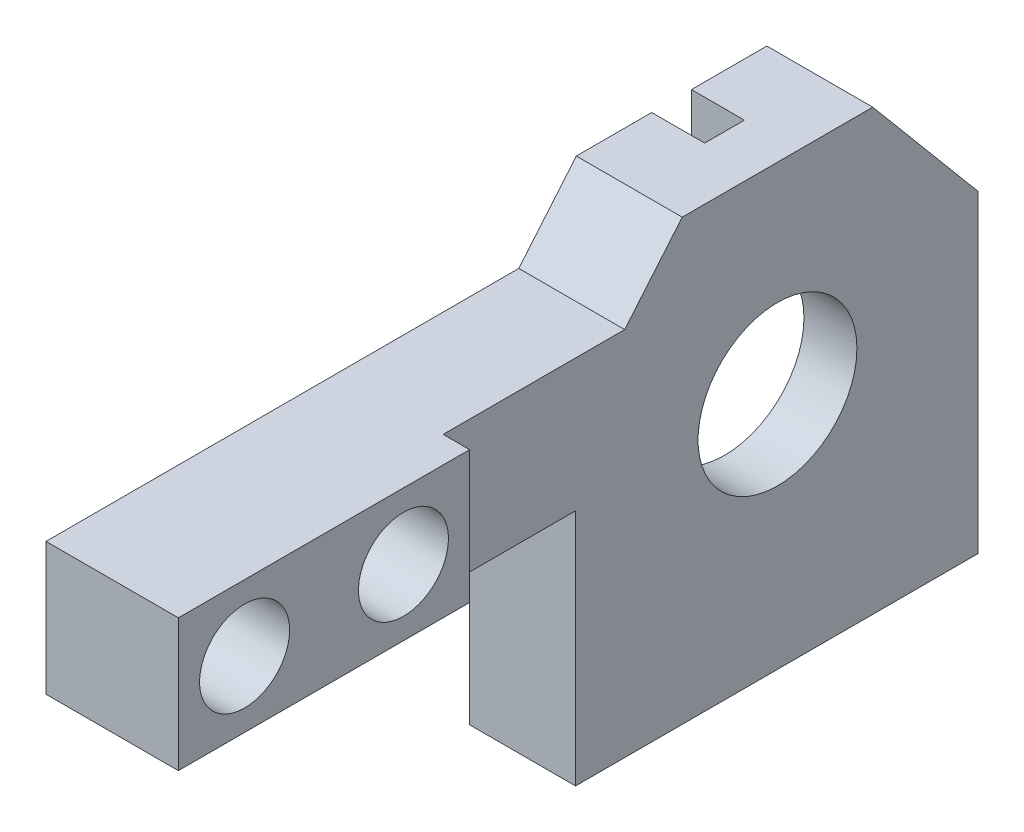
ISO-10303-21;
HEADER;
FILE_DESCRIPTION(('STEP AP214'),'2;1');
FILE_NAME('part.step','',(''),(''),'','','');
FILE_SCHEMA(('AUTOMOTIVE_DESIGN { 1 0 10303 214 1 1 1 1 }'));
ENDSEC;
DATA;
#1=APPLICATION_CONTEXT('core data for automotive mechanical design processes');
#2=APPLICATION_PROTOCOL_DEFINITION('international standard','automotive_design',2000,#1);
#3=PRODUCT_CONTEXT('',#1,'mechanical');
#4=PRODUCT('Part','Part','',(#3));
#5=PRODUCT_RELATED_PRODUCT_CATEGORY('part','',(#4));
#6=PRODUCT_DEFINITION_FORMATION('','',#4);
#7=PRODUCT_DEFINITION_CONTEXT('part definition',#1,'design');
#8=PRODUCT_DEFINITION('design','',#6,#7);
#9=PRODUCT_DEFINITION_SHAPE('','',#8);
#10=(LENGTH_UNIT() NAMED_UNIT(*) SI_UNIT(.MILLI.,.METRE.));
#11=(NAMED_UNIT(*) PLANE_ANGLE_UNIT() SI_UNIT($,.RADIAN.));
#12=(NAMED_UNIT(*) SI_UNIT($,.STERADIAN.) SOLID_ANGLE_UNIT());
#13=UNCERTAINTY_MEASURE_WITH_UNIT(LENGTH_MEASURE(1.E-05),#10,'distance_accuracy_value','');
#14=(GEOMETRIC_REPRESENTATION_CONTEXT(3) GLOBAL_UNCERTAINTY_ASSIGNED_CONTEXT((#13)) GLOBAL_UNIT_ASSIGNED_CONTEXT((#10,
#11,#12)) REPRESENTATION_CONTEXT('',''));
#15=CARTESIAN_POINT('',(0.,0.,0.));
#16=DIRECTION('',(0.,0.,1.));
#17=DIRECTION('',(1.,0.,0.));
#18=AXIS2_PLACEMENT_3D('',#15,#16,#17);
#19=CARTESIAN_POINT('',(0.,0.,0.));
#20=DIRECTION('',(1.,0.,0.));
#21=DIRECTION('',(0.,0.,1.));
#22=AXIS2_PLACEMENT_3D('',#19,#20,#21);
#23=PLANE('',#22);
#24=CARTESIAN_POINT('',(0.,1.90865976235804,0.482116569244563));
#25=DIRECTION('',(1.,0.,0.));
#26=DIRECTION('',(0.,0.,-1.));
#27=AXIS2_PLACEMENT_3D('',#24,#25,#26);
#28=CIRCLE('',#27,3.);
#29=CARTESIAN_POINT('',(0.,1.90865976235804,-2.51788343075544));
#30=VERTEX_POINT('',#29);
#31=EDGE_CURVE('E239',#30,#30,#28,.T.);
#32=ORIENTED_EDGE('',*,*,#31,.T.);
#33=EDGE_LOOP('',(#32));
#34=FACE_BOUND('',#33,.T.);
#35=DIRECTION('',(0.,1.,0.));
#36=VECTOR('',#35,1.);
#37=CARTESIAN_POINT('',(0.,7.49865976235804,1.23211656924456));
#38=LINE('',#37,#36);
#39=CARTESIAN_POINT('',(0.,7.49865976235804,1.23211656924456));
#40=VERTEX_POINT('',#39);
#41=CARTESIAN_POINT('',(0.,9.49865976235804,1.23211656924456));
#42=VERTEX_POINT('',#41);
#43=EDGE_CURVE('E314',#40,#42,#38,.T.);
#44=ORIENTED_EDGE('',*,*,#43,.T.);
#45=DIRECTION('',(0.,0.,1.));
#46=VECTOR('',#45,1.);
#47=CARTESIAN_POINT('',(0.,9.49865976235804,4.07990212889255));
#48=LINE('',#47,#46);
#49=CARTESIAN_POINT('',(0.,9.49865976235804,-0.267883430755437));
#50=VERTEX_POINT('',#49);
#51=EDGE_CURVE('E426',#50,#42,#48,.T.);
#52=ORIENTED_EDGE('',*,*,#51,.F.);
#53=DIRECTION('',(0.,-1.,0.));
#54=VECTOR('',#53,1.);
#55=CARTESIAN_POINT('',(0.,7.49865976235804,-0.267883430755437));
#56=LINE('',#55,#54);
#57=CARTESIAN_POINT('',(0.,7.49865976235804,-0.267883430755437));
#58=VERTEX_POINT('',#57);
#59=EDGE_CURVE('E346',#50,#58,#56,.T.);
#60=ORIENTED_EDGE('',*,*,#59,.T.);
#61=DIRECTION('',(0.,0.,-1.));
#62=VECTOR('',#61,1.);
#63=CARTESIAN_POINT('',(0.,7.49865976235804,-0.267883430755437));
#64=LINE('',#63,#62);
#65=CARTESIAN_POINT('',(0.,7.49865976235804,-2.18305367409341));
#66=VERTEX_POINT('',#65);
#67=EDGE_CURVE('E340',#58,#66,#64,.T.);
#68=ORIENTED_EDGE('',*,*,#67,.T.);
#69=DIRECTION('',(0.,-0.766044443118981,-0.642787609686535));
#70=VECTOR('',#69,1.);
#71=CARTESIAN_POINT('',(0.,4.03347195004924,-5.0906914893617));
#72=LINE('',#71,#70);
#73=CARTESIAN_POINT('',(0.,4.03347195004924,-5.0906914893617));
#74=VERTEX_POINT('',#73);
#75=EDGE_CURVE('E382',#66,#74,#72,.T.);
#76=ORIENTED_EDGE('',*,*,#75,.T.);
#77=DIRECTION('',(0.,-1.,0.));
#78=VECTOR('',#77,1.);
#79=CARTESIAN_POINT('',(0.,4.03347195004924,-5.0906914893617));
#80=LINE('',#79,#78);
#81=CARTESIAN_POINT('',(0.,-5.09134023764196,-5.0906914893617));
#82=VERTEX_POINT('',#81);
#83=EDGE_CURVE('E386',#74,#82,#80,.T.);
#84=ORIENTED_EDGE('',*,*,#83,.T.);
#85=DIRECTION('',(0.,0.,1.));
#86=VECTOR('',#85,1.);
#87=CARTESIAN_POINT('',(0.,-5.09134023764196,-3.01788343075544));
#88=LINE('',#87,#86);
#89=CARTESIAN_POINT('',(0.,-5.09134023764196,-3.01788343075544));
#90=VERTEX_POINT('',#89);
#91=EDGE_CURVE('E390',#82,#90,#88,.T.);
#92=ORIENTED_EDGE('',*,*,#91,.T.);
#93=DIRECTION('',(0.,-1.,0.));
#94=VECTOR('',#93,1.);
#95=CARTESIAN_POINT('',(0.,-5.09134023764196,-3.01788343075544));
#96=LINE('',#95,#94);
#97=CARTESIAN_POINT('',(0.,-7.09134023764196,-3.01788343075544));
#98=VERTEX_POINT('',#97);
#99=EDGE_CURVE('E394',#90,#98,#96,.T.);
#100=ORIENTED_EDGE('',*,*,#99,.T.);
#101=DIRECTION('',(0.,0.,-1.));
#102=VECTOR('',#101,1.);
#103=CARTESIAN_POINT('',(0.,-7.09134023764196,-7.0906914893617));
#104=LINE('',#103,#102);
#105=CARTESIAN_POINT('',(0.,-7.09134023764196,3.98211656924456));
#106=VERTEX_POINT('',#105);
#107=EDGE_CURVE('E421',#106,#98,#104,.T.);
#108=ORIENTED_EDGE('',*,*,#107,.F.);
#109=DIRECTION('',(0.,1.,0.));
#110=VECTOR('',#109,1.);
#111=CARTESIAN_POINT('',(0.,-5.09134023764196,3.98211656924456));
#112=LINE('',#111,#110);
#113=CARTESIAN_POINT('',(0.,-5.09134023764196,3.98211656924456));
#114=VERTEX_POINT('',#113);
#115=EDGE_CURVE('E268',#106,#114,#112,.T.);
#116=ORIENTED_EDGE('',*,*,#115,.T.);
#117=DIRECTION('',(0.,0.,1.));
#118=VECTOR('',#117,1.);
#119=CARTESIAN_POINT('',(0.,-5.09134023764196,6.1093085106383));
#120=LINE('',#119,#118);
#121=CARTESIAN_POINT('',(0.,-5.09134023764196,6.1093085106383));
#122=VERTEX_POINT('',#121);
#123=EDGE_CURVE('E261',#114,#122,#120,.T.);
#124=ORIENTED_EDGE('',*,*,#123,.T.);
#125=DIRECTION('',(0.,1.,0.));
#126=VECTOR('',#125,1.);
#127=CARTESIAN_POINT('',(0.,3.96865976235804,6.1093085106383));
#128=LINE('',#127,#126);
#129=CARTESIAN_POINT('',(0.,3.96865976235804,6.1093085106383));
#130=VERTEX_POINT('',#129);
#131=EDGE_CURVE('E303',#122,#130,#128,.T.);
#132=ORIENTED_EDGE('',*,*,#131,.T.);
#133=DIRECTION('',(0.,0.766044443118982,-0.642787609686534));
#134=VECTOR('',#133,1.);
#135=CARTESIAN_POINT('',(0.,3.96865976235804,6.1093085106383));
#136=LINE('',#135,#134);
#137=CARTESIAN_POINT('',(0.,7.49865976235804,3.14728681258254));
#138=VERTEX_POINT('',#137);
#139=EDGE_CURVE('E307',#130,#138,#136,.T.);
#140=ORIENTED_EDGE('',*,*,#139,.T.);
#141=DIRECTION('',(0.,0.,-1.));
#142=VECTOR('',#141,1.);
#143=CARTESIAN_POINT('',(0.,7.49865976235804,3.14728681258254));
#144=LINE('',#143,#142);
#145=EDGE_CURVE('E311',#138,#40,#144,.T.);
#146=ORIENTED_EDGE('',*,*,#145,.T.);
#147=EDGE_LOOP('',(#44,#52,#60,#68,#76,#84,#92,#100,#108,#116,#124,#132,#140,#146));
#148=FACE_BOUND('',#147,.T.);
#149=ADVANCED_FACE('F39',(#34,#148),#23,.F.);
#150=CARTESIAN_POINT('',(2.,-7.09134023764196,-7.0906914893617));
#151=DIRECTION('',(0.,-1.,0.));
#152=DIRECTION('',(0.,0.,-1.));
#153=AXIS2_PLACEMENT_3D('',#150,#151,#152);
#154=PLANE('',#153);
#155=ORIENTED_EDGE('',*,*,#107,.T.);
#156=DIRECTION('',(1.,0.,0.));
#157=VECTOR('',#156,1.);
#158=CARTESIAN_POINT('',(-2.,-7.09134023764196,-3.01788343075544));
#159=LINE('',#158,#157);
#160=CARTESIAN_POINT('',(-2.,-7.09134023764196,-3.01788343075544));
#161=VERTEX_POINT('',#160);
#162=EDGE_CURVE('E406',#161,#98,#159,.T.);
#163=ORIENTED_EDGE('',*,*,#162,.F.);
#164=DIRECTION('',(0.,0.,-1.));
#165=VECTOR('',#164,1.);
#166=CARTESIAN_POINT('',(-2.,-7.09134023764196,-3.01788343075544));
#167=LINE('',#166,#165);
#168=CARTESIAN_POINT('',(-2.,-7.09134023764196,-7.0906914893617));
#169=VERTEX_POINT('',#168);
#170=EDGE_CURVE('E361',#161,#169,#167,.T.);
#171=ORIENTED_EDGE('',*,*,#170,.T.);
#172=DIRECTION('',(-1.,0.,0.));
#173=VECTOR('',#172,1.);
#174=CARTESIAN_POINT('',(2.,-7.09134023764196,-7.0906914893617));
#175=LINE('',#174,#173);
#176=CARTESIAN_POINT('',(2.,-7.09134023764196,-7.0906914893617));
#177=VERTEX_POINT('',#176);
#178=EDGE_CURVE('E43',#177,#169,#175,.T.);
#179=ORIENTED_EDGE('',*,*,#178,.F.);
#180=DIRECTION('',(0.,0.,-1.));
#181=VECTOR('',#180,1.);
#182=CARTESIAN_POINT('',(2.,-7.09134023764196,-7.0906914893617));
#183=LINE('',#182,#181);
#184=CARTESIAN_POINT('',(2.,-7.09134023764196,8.1093085106383));
#185=VERTEX_POINT('',#184);
#186=EDGE_CURVE('E422',#185,#177,#183,.T.);
#187=ORIENTED_EDGE('',*,*,#186,.F.);
#188=DIRECTION('',(-1.,0.,0.));
#189=VECTOR('',#188,1.);
#190=CARTESIAN_POINT('',(2.,-7.09134023764196,8.1093085106383));
#191=LINE('',#190,#189);
#192=CARTESIAN_POINT('',(-2.,-7.09134023764196,8.1093085106383));
#193=VERTEX_POINT('',#192);
#194=EDGE_CURVE('E11',#185,#193,#191,.T.);
#195=ORIENTED_EDGE('',*,*,#194,.T.);
#196=DIRECTION('',(0.,0.,-1.));
#197=VECTOR('',#196,1.);
#198=CARTESIAN_POINT('',(-2.,-7.09134023764196,8.1093085106383));
#199=LINE('',#198,#197);
#200=CARTESIAN_POINT('',(-2.,-7.09134023764196,3.98211656924456));
#201=VERTEX_POINT('',#200);
#202=EDGE_CURVE('E292',#193,#201,#199,.T.);
#203=ORIENTED_EDGE('',*,*,#202,.T.);
#204=DIRECTION('',(1.,0.,0.));
#205=VECTOR('',#204,1.);
#206=CARTESIAN_POINT('',(-2.,-7.09134023764196,3.98211656924456));
#207=LINE('',#206,#205);
#208=EDGE_CURVE('E323',#201,#106,#207,.T.);
#209=ORIENTED_EDGE('',*,*,#208,.T.);
#210=EDGE_LOOP('',(#155,#163,#171,#179,#187,#195,#203,#209));
#211=FACE_BOUND('',#210,.T.);
#212=ADVANCED_FACE('F41',(#211),#154,.T.);
#213=CARTESIAN_POINT('',(2.,-7.09134023764196,8.1093085106383));
#214=DIRECTION('',(0.,0.,1.));
#215=DIRECTION('',(0.,-1.,0.));
#216=AXIS2_PLACEMENT_3D('',#213,#214,#215);
#217=PLANE('',#216);
#218=DIRECTION('',(-1.,0.,0.));
#219=VECTOR('',#218,1.);
#220=CARTESIAN_POINT('',(3.,1.90865976235804,8.1093085106383));
#221=LINE('',#220,#219);
#222=CARTESIAN_POINT('',(2.,1.90865976235804,8.1093085106383));
#223=VERTEX_POINT('',#222);
#224=CARTESIAN_POINT('',(-2.,1.90865976235804,8.1093085106383));
#225=VERTEX_POINT('',#224);
#226=EDGE_CURVE('E229',#223,#225,#221,.T.);
#227=ORIENTED_EDGE('',*,*,#226,.T.);
#228=DIRECTION('',(0.,-1.,0.));
#229=VECTOR('',#228,1.);
#230=CARTESIAN_POINT('',(-2.,4.69660023089044,8.1093085106383));
#231=LINE('',#230,#229);
#232=EDGE_CURVE('E289',#225,#193,#231,.T.);
#233=ORIENTED_EDGE('',*,*,#232,.T.);
#234=ORIENTED_EDGE('',*,*,#194,.F.);
#235=DIRECTION('',(0.,-1.,0.));
#236=VECTOR('',#235,1.);
#237=CARTESIAN_POINT('',(2.,-7.09134023764196,8.1093085106383));
#238=LINE('',#237,#236);
#239=EDGE_CURVE('E216',#223,#185,#238,.T.);
#240=ORIENTED_EDGE('',*,*,#239,.F.);
#241=EDGE_LOOP('',(#227,#233,#234,#240));
#242=FACE_BOUND('',#241,.T.);
#243=ADVANCED_FACE('F228',(#242),#217,.T.);
#244=CARTESIAN_POINT('',(2.,4.69660023089044,8.1093085106383));
#245=DIRECTION('',(0.,0.642787609686534,0.766044443118982));
#246=DIRECTION('',(0.,-0.766044443118982,0.642787609686534));
#247=AXIS2_PLACEMENT_3D('',#244,#245,#246);
#248=PLANE('',#247);
#249=DIRECTION('',(-1.,0.,0.));
#250=VECTOR('',#249,1.);
#251=CARTESIAN_POINT('',(3.,6.90865976235804,6.25317017364167));
#252=LINE('',#251,#250);
#253=CARTESIAN_POINT('',(2.,6.90865976235804,6.25317017364167));
#254=VERTEX_POINT('',#253);
#255=CARTESIAN_POINT('',(-2.,6.90865976235804,6.25317017364167));
#256=VERTEX_POINT('',#255);
#257=EDGE_CURVE('E254',#254,#256,#252,.T.);
#258=ORIENTED_EDGE('',*,*,#257,.F.);
#259=DIRECTION('',(0.,-0.766044443118982,0.642787609686534));
#260=VECTOR('',#259,1.);
#261=CARTESIAN_POINT('',(2.,4.69660023089044,8.1093085106383));
#262=LINE('',#261,#260);
#263=CARTESIAN_POINT('',(2.,9.49865976235804,4.07990212889255));
#264=VERTEX_POINT('',#263);
#265=EDGE_CURVE('E232',#264,#254,#262,.T.);
#266=ORIENTED_EDGE('',*,*,#265,.F.);
#267=DIRECTION('',(-1.,0.,0.));
#268=VECTOR('',#267,1.);
#269=CARTESIAN_POINT('',(2.,9.49865976235804,4.07990212889255));
#270=LINE('',#269,#268);
#271=CARTESIAN_POINT('',(-2.,9.49865976235804,4.07990212889255));
#272=VERTEX_POINT('',#271);
#273=EDGE_CURVE('E49',#264,#272,#270,.T.);
#274=ORIENTED_EDGE('',*,*,#273,.T.);
#275=DIRECTION('',(0.,-0.766044443118982,0.642787609686534));
#276=VECTOR('',#275,1.);
#277=CARTESIAN_POINT('',(-2.,4.69660023089044,8.1093085106383));
#278=LINE('',#277,#276);
#279=EDGE_CURVE('E285',#272,#256,#278,.T.);
#280=ORIENTED_EDGE('',*,*,#279,.T.);
#281=EDGE_LOOP('',(#258,#266,#274,#280));
#282=FACE_BOUND('',#281,.T.);
#283=ADVANCED_FACE('F525',(#282),#248,.T.);
#284=CARTESIAN_POINT('',(2.,9.49865976235804,4.07990212889255));
#285=DIRECTION('',(0.,1.,0.));
#286=DIRECTION('',(0.,0.,1.));
#287=AXIS2_PLACEMENT_3D('',#284,#285,#286);
#288=PLANE('',#287);
#289=ORIENTED_EDGE('',*,*,#51,.T.);
#290=DIRECTION('',(1.,0.,0.));
#291=VECTOR('',#290,1.);
#292=CARTESIAN_POINT('',(-2.,9.49865976235804,1.23211656924456));
#293=LINE('',#292,#291);
#294=CARTESIAN_POINT('',(-2.,9.49865976235804,1.23211656924456));
#295=VERTEX_POINT('',#294);
#296=EDGE_CURVE('E326',#295,#42,#293,.T.);
#297=ORIENTED_EDGE('',*,*,#296,.F.);
#298=DIRECTION('',(0.,0.,1.));
#299=VECTOR('',#298,1.);
#300=CARTESIAN_POINT('',(-2.,9.49865976235804,4.07990212889255));
#301=LINE('',#300,#299);
#302=EDGE_CURVE('E282',#295,#272,#301,.T.);
#303=ORIENTED_EDGE('',*,*,#302,.T.);
#304=ORIENTED_EDGE('',*,*,#273,.F.);
#305=DIRECTION('',(0.,0.,1.));
#306=VECTOR('',#305,1.);
#307=CARTESIAN_POINT('',(2.,9.49865976235804,4.07990212889255));
#308=LINE('',#307,#306);
#309=CARTESIAN_POINT('',(2.,9.49865976235804,-3.11566899040342));
#310=VERTEX_POINT('',#309);
#311=EDGE_CURVE('E432',#310,#264,#308,.T.);
#312=ORIENTED_EDGE('',*,*,#311,.F.);
#313=DIRECTION('',(-1.,0.,0.));
#314=VECTOR('',#313,1.);
#315=CARTESIAN_POINT('',(2.,9.49865976235804,-3.11566899040342));
#316=LINE('',#315,#314);
#317=CARTESIAN_POINT('',(-2.,9.49865976235804,-3.11566899040342));
#318=VERTEX_POINT('',#317);
#319=EDGE_CURVE('E447',#310,#318,#316,.T.);
#320=ORIENTED_EDGE('',*,*,#319,.T.);
#321=DIRECTION('',(0.,0.,1.));
#322=VECTOR('',#321,1.);
#323=CARTESIAN_POINT('',(-2.,9.49865976235804,-0.267883430755437));
#324=LINE('',#323,#322);
#325=CARTESIAN_POINT('',(-2.,9.49865976235804,-0.267883430755437));
#326=VERTEX_POINT('',#325);
#327=EDGE_CURVE('E371',#318,#326,#324,.T.);
#328=ORIENTED_EDGE('',*,*,#327,.T.);
#329=DIRECTION('',(1.,0.,0.));
#330=VECTOR('',#329,1.);
#331=CARTESIAN_POINT('',(-2.,9.49865976235804,-0.267883430755437));
#332=LINE('',#331,#330);
#333=EDGE_CURVE('E403',#326,#50,#332,.T.);
#334=ORIENTED_EDGE('',*,*,#333,.T.);
#335=EDGE_LOOP('',(#289,#297,#303,#304,#312,#320,#328,#334));
#336=FACE_BOUND('',#335,.T.);
#337=ADVANCED_FACE('F475',(#336),#288,.T.);
#338=CARTESIAN_POINT('',(2.,9.49865976235804,-3.11566899040342));
#339=DIRECTION('',(0.,0.642787609686535,-0.766044443118981));
#340=DIRECTION('',(0.,0.766044443118982,0.642787609686535));
#341=AXIS2_PLACEMENT_3D('',#338,#339,#340);
#342=PLANE('',#341);
#343=ORIENTED_EDGE('',*,*,#319,.F.);
#344=DIRECTION('',(0.,0.766044443118982,0.642787609686535));
#345=VECTOR('',#344,1.);
#346=CARTESIAN_POINT('',(2.,9.49865976235804,-3.11566899040342));
#347=LINE('',#346,#345);
#348=CARTESIAN_POINT('',(2.,4.76141241858164,-7.0906914893617));
#349=VERTEX_POINT('',#348);
#350=EDGE_CURVE('E429',#349,#310,#347,.T.);
#351=ORIENTED_EDGE('',*,*,#350,.F.);
#352=DIRECTION('',(-1.,0.,0.));
#353=VECTOR('',#352,1.);
#354=CARTESIAN_POINT('',(2.,4.76141241858164,-7.0906914893617));
#355=LINE('',#354,#353);
#356=CARTESIAN_POINT('',(-2.,4.76141241858164,-7.0906914893617));
#357=VERTEX_POINT('',#356);
#358=EDGE_CURVE('E450',#349,#357,#355,.T.);
#359=ORIENTED_EDGE('',*,*,#358,.T.);
#360=DIRECTION('',(0.,0.766044443118982,0.642787609686535));
#361=VECTOR('',#360,1.);
#362=CARTESIAN_POINT('',(-2.,9.49865976235804,-3.11566899040342));
#363=LINE('',#362,#361);
#364=EDGE_CURVE('E368',#357,#318,#363,.T.);
#365=ORIENTED_EDGE('',*,*,#364,.T.);
#366=EDGE_LOOP('',(#343,#351,#359,#365));
#367=FACE_BOUND('',#366,.T.);
#368=ADVANCED_FACE('F471',(#367),#342,.T.);
#369=CARTESIAN_POINT('',(2.,4.76141241858164,-7.0906914893617));
#370=DIRECTION('',(0.,0.,-1.));
#371=DIRECTION('',(0.,1.,0.));
#372=AXIS2_PLACEMENT_3D('',#369,#370,#371);
#373=PLANE('',#372);
#374=ORIENTED_EDGE('',*,*,#358,.F.);
#375=DIRECTION('',(0.,1.,0.));
#376=VECTOR('',#375,1.);
#377=CARTESIAN_POINT('',(2.,4.76141241858164,-7.0906914893617));
#378=LINE('',#377,#376);
#379=EDGE_CURVE('E425',#177,#349,#378,.T.);
#380=ORIENTED_EDGE('',*,*,#379,.F.);
#381=ORIENTED_EDGE('',*,*,#178,.T.);
#382=DIRECTION('',(0.,1.,0.));
#383=VECTOR('',#382,1.);
#384=CARTESIAN_POINT('',(-2.,4.76141241858164,-7.0906914893617));
#385=LINE('',#384,#383);
#386=EDGE_CURVE('E365',#169,#357,#385,.T.);
#387=ORIENTED_EDGE('',*,*,#386,.T.);
#388=EDGE_LOOP('',(#374,#380,#381,#387));
#389=FACE_BOUND('',#388,.T.);
#390=ADVANCED_FACE('F460',(#389),#373,.T.);
#391=CARTESIAN_POINT('',(2.,0.,0.));
#392=DIRECTION('',(1.,0.,0.));
#393=DIRECTION('',(0.,0.,1.));
#394=AXIS2_PLACEMENT_3D('',#391,#392,#393);
#395=PLANE('',#394);
#396=ORIENTED_EDGE('',*,*,#239,.T.);
#397=ORIENTED_EDGE('',*,*,#186,.T.);
#398=ORIENTED_EDGE('',*,*,#379,.T.);
#399=ORIENTED_EDGE('',*,*,#350,.T.);
#400=ORIENTED_EDGE('',*,*,#311,.T.);
#401=ORIENTED_EDGE('',*,*,#265,.T.);
#402=DIRECTION('',(0.,0.,-1.));
#403=VECTOR('',#402,1.);
#404=CARTESIAN_POINT('',(2.,6.90865976235804,8.1093085106383));
#405=LINE('',#404,#403);
#406=CARTESIAN_POINT('',(2.,6.90865976235804,13.1093085106383));
#407=VERTEX_POINT('',#406);
#408=EDGE_CURVE('E529',#407,#254,#405,.T.);
#409=ORIENTED_EDGE('',*,*,#408,.F.);
#410=DIRECTION('',(0.,1.,0.));
#411=VECTOR('',#410,1.);
#412=CARTESIAN_POINT('',(2.,6.90865976235804,13.1093085106383));
#413=LINE('',#412,#411);
#414=CARTESIAN_POINT('',(2.,1.90865976235804,13.1093085106383));
#415=VERTEX_POINT('',#414);
#416=EDGE_CURVE('E220',#415,#407,#413,.T.);
#417=ORIENTED_EDGE('',*,*,#416,.F.);
#418=DIRECTION('',(0.,0.,1.));
#419=VECTOR('',#418,1.);
#420=CARTESIAN_POINT('',(2.,1.90865976235804,13.1093085106383));
#421=LINE('',#420,#419);
#422=EDGE_CURVE('E211',#223,#415,#421,.T.);
#423=ORIENTED_EDGE('',*,*,#422,.F.);
#424=EDGE_LOOP('',(#396,#397,#398,#399,#400,#401,#409,#417,#423));
#425=FACE_BOUND('',#424,.T.);
#426=CARTESIAN_POINT('',(2.,1.90865976235804,0.482116569244563));
#427=DIRECTION('',(1.,0.,0.));
#428=DIRECTION('',(0.,0.,-1.));
#429=AXIS2_PLACEMENT_3D('',#426,#427,#428);
#430=CIRCLE('',#429,3.);
#431=CARTESIAN_POINT('',(2.,1.90865976235804,-2.51788343075544));
#432=VERTEX_POINT('',#431);
#433=EDGE_CURVE('E245',#432,#432,#430,.T.);
#434=ORIENTED_EDGE('',*,*,#433,.F.);
#435=EDGE_LOOP('',(#434));
#436=FACE_BOUND('',#435,.T.);
#437=ADVANCED_FACE('F213',(#425,#436),#395,.T.);
#438=CARTESIAN_POINT('',(-2.,7.49865976235804,-0.267883430755437));
#439=DIRECTION('',(0.,1.,0.));
#440=DIRECTION('',(0.,0.,1.));
#441=AXIS2_PLACEMENT_3D('',#438,#439,#440);
#442=PLANE('',#441);
#443=ORIENTED_EDGE('',*,*,#67,.F.);
#444=DIRECTION('',(1.,0.,0.));
#445=VECTOR('',#444,1.);
#446=CARTESIAN_POINT('',(-2.,7.49865976235804,-0.267883430755437));
#447=LINE('',#446,#445);
#448=CARTESIAN_POINT('',(-2.,7.49865976235804,-0.267883430755437));
#449=VERTEX_POINT('',#448);
#450=EDGE_CURVE('E378',#449,#58,#447,.T.);
#451=ORIENTED_EDGE('',*,*,#450,.F.);
#452=DIRECTION('',(0.,0.,-1.));
#453=VECTOR('',#452,1.);
#454=CARTESIAN_POINT('',(-2.,7.49865976235804,-0.267883430755437));
#455=LINE('',#454,#453);
#456=CARTESIAN_POINT('',(-2.,7.49865976235804,-2.18305367409341));
#457=VERTEX_POINT('',#456);
#458=EDGE_CURVE('E341',#449,#457,#455,.T.);
#459=ORIENTED_EDGE('',*,*,#458,.T.);
#460=DIRECTION('',(1.,0.,0.));
#461=VECTOR('',#460,1.);
#462=CARTESIAN_POINT('',(-2.,7.49865976235804,-2.18305367409341));
#463=LINE('',#462,#461);
#464=EDGE_CURVE('E418',#457,#66,#463,.T.);
#465=ORIENTED_EDGE('',*,*,#464,.T.);
#466=EDGE_LOOP('',(#443,#451,#459,#465));
#467=FACE_BOUND('',#466,.T.);
#468=ADVANCED_FACE('F509',(#467),#442,.F.);
#469=CARTESIAN_POINT('',(-2.,4.03347195004924,-5.0906914893617));
#470=DIRECTION('',(0.,0.642787609686535,-0.766044443118982));
#471=DIRECTION('',(0.,0.766044443118982,0.642787609686535));
#472=AXIS2_PLACEMENT_3D('',#469,#470,#471);
#473=PLANE('',#472);
#474=ORIENTED_EDGE('',*,*,#75,.F.);
#475=ORIENTED_EDGE('',*,*,#464,.F.);
#476=DIRECTION('',(0.,-0.766044443118981,-0.642787609686535));
#477=VECTOR('',#476,1.);
#478=CARTESIAN_POINT('',(-2.,4.03347195004924,-5.0906914893617));
#479=LINE('',#478,#477);
#480=CARTESIAN_POINT('',(-2.,4.03347195004924,-5.0906914893617));
#481=VERTEX_POINT('',#480);
#482=EDGE_CURVE('E345',#457,#481,#479,.T.);
#483=ORIENTED_EDGE('',*,*,#482,.T.);
#484=DIRECTION('',(1.,0.,0.));
#485=VECTOR('',#484,1.);
#486=CARTESIAN_POINT('',(-2.,4.03347195004924,-5.0906914893617));
#487=LINE('',#486,#485);
#488=EDGE_CURVE('E415',#481,#74,#487,.T.);
#489=ORIENTED_EDGE('',*,*,#488,.T.);
#490=EDGE_LOOP('',(#474,#475,#483,#489));
#491=FACE_BOUND('',#490,.T.);
#492=ADVANCED_FACE('F505',(#491),#473,.F.);
#493=CARTESIAN_POINT('',(-2.,4.03347195004924,-5.0906914893617));
#494=DIRECTION('',(0.,0.,-1.));
#495=DIRECTION('',(0.,1.,0.));
#496=AXIS2_PLACEMENT_3D('',#493,#494,#495);
#497=PLANE('',#496);
#498=ORIENTED_EDGE('',*,*,#83,.F.);
#499=ORIENTED_EDGE('',*,*,#488,.F.);
#500=DIRECTION('',(0.,-1.,0.));
#501=VECTOR('',#500,1.);
#502=CARTESIAN_POINT('',(-2.,4.03347195004924,-5.0906914893617));
#503=LINE('',#502,#501);
#504=CARTESIAN_POINT('',(-2.,-5.09134023764196,-5.0906914893617));
#505=VERTEX_POINT('',#504);
#506=EDGE_CURVE('E350',#481,#505,#503,.T.);
#507=ORIENTED_EDGE('',*,*,#506,.T.);
#508=DIRECTION('',(1.,0.,0.));
#509=VECTOR('',#508,1.);
#510=CARTESIAN_POINT('',(-2.,-5.09134023764196,-5.0906914893617));
#511=LINE('',#510,#509);
#512=EDGE_CURVE('E412',#505,#82,#511,.T.);
#513=ORIENTED_EDGE('',*,*,#512,.T.);
#514=EDGE_LOOP('',(#498,#499,#507,#513));
#515=FACE_BOUND('',#514,.T.);
#516=ADVANCED_FACE('F502',(#515),#497,.F.);
#517=CARTESIAN_POINT('',(-2.,-5.09134023764196,-3.01788343075544));
#518=DIRECTION('',(0.,-1.,0.));
#519=DIRECTION('',(0.,0.,-1.));
#520=AXIS2_PLACEMENT_3D('',#517,#518,#519);
#521=PLANE('',#520);
#522=ORIENTED_EDGE('',*,*,#91,.F.);
#523=ORIENTED_EDGE('',*,*,#512,.F.);
#524=DIRECTION('',(0.,0.,1.));
#525=VECTOR('',#524,1.);
#526=CARTESIAN_POINT('',(-2.,-5.09134023764196,-3.01788343075544));
#527=LINE('',#526,#525);
#528=CARTESIAN_POINT('',(-2.,-5.09134023764196,-3.01788343075544));
#529=VERTEX_POINT('',#528);
#530=EDGE_CURVE('E354',#505,#529,#527,.T.);
#531=ORIENTED_EDGE('',*,*,#530,.T.);
#532=DIRECTION('',(1.,0.,0.));
#533=VECTOR('',#532,1.);
#534=CARTESIAN_POINT('',(-2.,-5.09134023764196,-3.01788343075544));
#535=LINE('',#534,#533);
#536=EDGE_CURVE('E409',#529,#90,#535,.T.);
#537=ORIENTED_EDGE('',*,*,#536,.T.);
#538=EDGE_LOOP('',(#522,#523,#531,#537));
#539=FACE_BOUND('',#538,.T.);
#540=ADVANCED_FACE('F497',(#539),#521,.F.);
#541=CARTESIAN_POINT('',(-2.,-5.09134023764196,-3.01788343075544));
#542=DIRECTION('',(0.,0.,-1.));
#543=DIRECTION('',(0.,1.,0.));
#544=AXIS2_PLACEMENT_3D('',#541,#542,#543);
#545=PLANE('',#544);
#546=ORIENTED_EDGE('',*,*,#99,.F.);
#547=ORIENTED_EDGE('',*,*,#536,.F.);
#548=DIRECTION('',(0.,-1.,0.));
#549=VECTOR('',#548,1.);
#550=CARTESIAN_POINT('',(-2.,-5.09134023764196,-3.01788343075544));
#551=LINE('',#550,#549);
#552=EDGE_CURVE('E358',#529,#161,#551,.T.);
#553=ORIENTED_EDGE('',*,*,#552,.T.);
#554=ORIENTED_EDGE('',*,*,#162,.T.);
#555=EDGE_LOOP('',(#546,#547,#553,#554));
#556=FACE_BOUND('',#555,.T.);
#557=ADVANCED_FACE('F494',(#556),#545,.F.);
#558=CARTESIAN_POINT('',(-2.,7.49865976235804,-0.267883430755437));
#559=DIRECTION('',(0.,0.,-1.));
#560=DIRECTION('',(1.,0.,0.));
#561=AXIS2_PLACEMENT_3D('',#558,#559,#560);
#562=PLANE('',#561);
#563=ORIENTED_EDGE('',*,*,#59,.F.);
#564=ORIENTED_EDGE('',*,*,#333,.F.);
#565=DIRECTION('',(0.,-1.,0.));
#566=VECTOR('',#565,1.);
#567=CARTESIAN_POINT('',(-2.,7.49865976235804,-0.267883430755437));
#568=LINE('',#567,#566);
#569=EDGE_CURVE('E375',#326,#449,#568,.T.);
#570=ORIENTED_EDGE('',*,*,#569,.T.);
#571=ORIENTED_EDGE('',*,*,#450,.T.);
#572=EDGE_LOOP('',(#563,#564,#570,#571));
#573=FACE_BOUND('',#572,.T.);
#574=ADVANCED_FACE('F513',(#573),#562,.F.);
#575=CARTESIAN_POINT('',(-2.,0.,0.));
#576=DIRECTION('',(1.,0.,0.));
#577=DIRECTION('',(0.,0.,1.));
#578=AXIS2_PLACEMENT_3D('',#575,#576,#577);
#579=PLANE('',#578);
#580=ORIENTED_EDGE('',*,*,#458,.F.);
#581=ORIENTED_EDGE('',*,*,#569,.F.);
#582=ORIENTED_EDGE('',*,*,#327,.F.);
#583=ORIENTED_EDGE('',*,*,#364,.F.);
#584=ORIENTED_EDGE('',*,*,#386,.F.);
#585=ORIENTED_EDGE('',*,*,#170,.F.);
#586=ORIENTED_EDGE('',*,*,#552,.F.);
#587=ORIENTED_EDGE('',*,*,#530,.F.);
#588=ORIENTED_EDGE('',*,*,#506,.F.);
#589=ORIENTED_EDGE('',*,*,#482,.F.);
#590=EDGE_LOOP('',(#580,#581,#582,#583,#584,#585,#586,#587,#588,#589));
#591=FACE_BOUND('',#590,.T.);
#592=ADVANCED_FACE('F467',(#591),#579,.F.);
#593=CARTESIAN_POINT('',(-2.,-5.09134023764196,6.1093085106383));
#594=DIRECTION('',(0.,-1.,0.));
#595=DIRECTION('',(0.,0.,-1.));
#596=AXIS2_PLACEMENT_3D('',#593,#594,#595);
#597=PLANE('',#596);
#598=ORIENTED_EDGE('',*,*,#123,.F.);
#599=DIRECTION('',(1.,0.,0.));
#600=VECTOR('',#599,1.);
#601=CARTESIAN_POINT('',(-2.,-5.09134023764196,3.98211656924456));
#602=LINE('',#601,#600);
#603=CARTESIAN_POINT('',(-2.,-5.09134023764196,3.98211656924456));
#604=VERTEX_POINT('',#603);
#605=EDGE_CURVE('E299',#604,#114,#602,.T.);
#606=ORIENTED_EDGE('',*,*,#605,.F.);
#607=DIRECTION('',(0.,0.,1.));
#608=VECTOR('',#607,1.);
#609=CARTESIAN_POINT('',(-2.,-5.09134023764196,6.1093085106383));
#610=LINE('',#609,#608);
#611=CARTESIAN_POINT('',(-2.,-5.09134023764196,6.1093085106383));
#612=VERTEX_POINT('',#611);
#613=EDGE_CURVE('E263',#604,#612,#610,.T.);
#614=ORIENTED_EDGE('',*,*,#613,.T.);
#615=DIRECTION('',(1.,0.,0.));
#616=VECTOR('',#615,1.);
#617=CARTESIAN_POINT('',(-2.,-5.09134023764196,6.1093085106383));
#618=LINE('',#617,#616);
#619=EDGE_CURVE('E337',#612,#122,#618,.T.);
#620=ORIENTED_EDGE('',*,*,#619,.T.);
#621=EDGE_LOOP('',(#598,#606,#614,#620));
#622=FACE_BOUND('',#621,.T.);
#623=ADVANCED_FACE('F634',(#622),#597,.F.);
#624=CARTESIAN_POINT('',(-2.,3.96865976235804,6.1093085106383));
#625=DIRECTION('',(0.,0.,1.));
#626=DIRECTION('',(0.,-1.,0.));
#627=AXIS2_PLACEMENT_3D('',#624,#625,#626);
#628=PLANE('',#627);
#629=ORIENTED_EDGE('',*,*,#131,.F.);
#630=ORIENTED_EDGE('',*,*,#619,.F.);
#631=DIRECTION('',(0.,1.,0.));
#632=VECTOR('',#631,1.);
#633=CARTESIAN_POINT('',(-2.,3.96865976235804,6.1093085106383));
#634=LINE('',#633,#632);
#635=CARTESIAN_POINT('',(-2.,3.96865976235804,6.1093085106383));
#636=VERTEX_POINT('',#635);
#637=EDGE_CURVE('E267',#612,#636,#634,.T.);
#638=ORIENTED_EDGE('',*,*,#637,.T.);
#639=DIRECTION('',(1.,0.,0.));
#640=VECTOR('',#639,1.);
#641=CARTESIAN_POINT('',(-2.,3.96865976235804,6.1093085106383));
#642=LINE('',#641,#640);
#643=EDGE_CURVE('E334',#636,#130,#642,.T.);
#644=ORIENTED_EDGE('',*,*,#643,.T.);
#645=EDGE_LOOP('',(#629,#630,#638,#644));
#646=FACE_BOUND('',#645,.T.);
#647=ADVANCED_FACE('F637',(#646),#628,.F.);
#648=CARTESIAN_POINT('',(-2.,3.96865976235804,6.1093085106383));
#649=DIRECTION('',(0.,0.642787609686534,0.766044443118982));
#650=DIRECTION('',(0.,-0.766044443118982,0.642787609686534));
#651=AXIS2_PLACEMENT_3D('',#648,#649,#650);
#652=PLANE('',#651);
#653=ORIENTED_EDGE('',*,*,#139,.F.);
#654=ORIENTED_EDGE('',*,*,#643,.F.);
#655=DIRECTION('',(0.,0.766044443118982,-0.642787609686534));
#656=VECTOR('',#655,1.);
#657=CARTESIAN_POINT('',(-2.,3.96865976235804,6.1093085106383));
#658=LINE('',#657,#656);
#659=CARTESIAN_POINT('',(-2.,7.49865976235804,3.14728681258254));
#660=VERTEX_POINT('',#659);
#661=EDGE_CURVE('E272',#636,#660,#658,.T.);
#662=ORIENTED_EDGE('',*,*,#661,.T.);
#663=DIRECTION('',(1.,0.,0.));
#664=VECTOR('',#663,1.);
#665=CARTESIAN_POINT('',(-2.,7.49865976235804,3.14728681258254));
#666=LINE('',#665,#664);
#667=EDGE_CURVE('E331',#660,#138,#666,.T.);
#668=ORIENTED_EDGE('',*,*,#667,.T.);
#669=EDGE_LOOP('',(#653,#654,#662,#668));
#670=FACE_BOUND('',#669,.T.);
#671=ADVANCED_FACE('F641',(#670),#652,.F.);
#672=CARTESIAN_POINT('',(-2.,7.49865976235804,3.14728681258254));
#673=DIRECTION('',(0.,1.,0.));
#674=DIRECTION('',(0.,0.,1.));
#675=AXIS2_PLACEMENT_3D('',#672,#673,#674);
#676=PLANE('',#675);
#677=ORIENTED_EDGE('',*,*,#145,.F.);
#678=ORIENTED_EDGE('',*,*,#667,.F.);
#679=DIRECTION('',(0.,0.,-1.));
#680=VECTOR('',#679,1.);
#681=CARTESIAN_POINT('',(-2.,7.49865976235804,3.14728681258254));
#682=LINE('',#681,#680);
#683=CARTESIAN_POINT('',(-2.,7.49865976235804,1.23211656924456));
#684=VERTEX_POINT('',#683);
#685=EDGE_CURVE('E276',#660,#684,#682,.T.);
#686=ORIENTED_EDGE('',*,*,#685,.T.);
#687=DIRECTION('',(1.,0.,0.));
#688=VECTOR('',#687,1.);
#689=CARTESIAN_POINT('',(-2.,7.49865976235804,1.23211656924456));
#690=LINE('',#689,#688);
#691=EDGE_CURVE('E65',#684,#40,#690,.T.);
#692=ORIENTED_EDGE('',*,*,#691,.T.);
#693=EDGE_LOOP('',(#677,#678,#686,#692));
#694=FACE_BOUND('',#693,.T.);
#695=ADVANCED_FACE('F645',(#694),#676,.F.);
#696=CARTESIAN_POINT('',(-2.,7.49865976235804,1.23211656924456));
#697=DIRECTION('',(0.,0.,1.));
#698=DIRECTION('',(-1.,0.,0.));
#699=AXIS2_PLACEMENT_3D('',#696,#697,#698);
#700=PLANE('',#699);
#701=ORIENTED_EDGE('',*,*,#43,.F.);
#702=ORIENTED_EDGE('',*,*,#691,.F.);
#703=DIRECTION('',(0.,1.,0.));
#704=VECTOR('',#703,1.);
#705=CARTESIAN_POINT('',(-2.,7.49865976235804,1.23211656924456));
#706=LINE('',#705,#704);
#707=EDGE_CURVE('E279',#684,#295,#706,.T.);
#708=ORIENTED_EDGE('',*,*,#707,.T.);
#709=ORIENTED_EDGE('',*,*,#296,.T.);
#710=EDGE_LOOP('',(#701,#702,#708,#709));
#711=FACE_BOUND('',#710,.T.);
#712=ADVANCED_FACE('F518',(#711),#700,.F.);
#713=CARTESIAN_POINT('',(-2.,-5.09134023764196,3.98211656924456));
#714=DIRECTION('',(0.,0.,1.));
#715=DIRECTION('',(-1.,0.,0.));
#716=AXIS2_PLACEMENT_3D('',#713,#714,#715);
#717=PLANE('',#716);
#718=ORIENTED_EDGE('',*,*,#115,.F.);
#719=ORIENTED_EDGE('',*,*,#208,.F.);
#720=DIRECTION('',(0.,1.,0.));
#721=VECTOR('',#720,1.);
#722=CARTESIAN_POINT('',(-2.,-5.09134023764196,3.98211656924456));
#723=LINE('',#722,#721);
#724=EDGE_CURVE('E296',#201,#604,#723,.T.);
#725=ORIENTED_EDGE('',*,*,#724,.T.);
#726=ORIENTED_EDGE('',*,*,#605,.T.);
#727=EDGE_LOOP('',(#718,#719,#725,#726));
#728=FACE_BOUND('',#727,.T.);
#729=ADVANCED_FACE('F487',(#728),#717,.F.);
#730=CARTESIAN_POINT('',(-2.,0.,0.));
#731=DIRECTION('',(1.,0.,0.));
#732=DIRECTION('',(0.,0.,1.));
#733=AXIS2_PLACEMENT_3D('',#730,#731,#732);
#734=PLANE('',#733);
#735=DIRECTION('',(0.,0.,-1.));
#736=VECTOR('',#735,1.);
#737=CARTESIAN_POINT('',(-2.,1.90865976235804,15.4821165692446));
#738=LINE('',#737,#736);
#739=CARTESIAN_POINT('',(-2.,1.90865976235804,24.1093085106383));
#740=VERTEX_POINT('',#739);
#741=EDGE_CURVE('E236',#740,#225,#738,.T.);
#742=ORIENTED_EDGE('',*,*,#741,.F.);
#743=DIRECTION('',(0.,-1.,0.));
#744=VECTOR('',#743,1.);
#745=CARTESIAN_POINT('',(-2.,1.90865976235804,24.1093085106383));
#746=LINE('',#745,#744);
#747=CARTESIAN_POINT('',(-2.,6.90865976235804,24.1093085106383));
#748=VERTEX_POINT('',#747);
#749=EDGE_CURVE('E569',#748,#740,#746,.T.);
#750=ORIENTED_EDGE('',*,*,#749,.F.);
#751=DIRECTION('',(0.,0.,1.));
#752=VECTOR('',#751,1.);
#753=CARTESIAN_POINT('',(-2.,6.90865976235804,24.1093085106383));
#754=LINE('',#753,#752);
#755=EDGE_CURVE('E523',#256,#748,#754,.T.);
#756=ORIENTED_EDGE('',*,*,#755,.F.);
#757=ORIENTED_EDGE('',*,*,#279,.F.);
#758=ORIENTED_EDGE('',*,*,#302,.F.);
#759=ORIENTED_EDGE('',*,*,#707,.F.);
#760=ORIENTED_EDGE('',*,*,#685,.F.);
#761=ORIENTED_EDGE('',*,*,#661,.F.);
#762=ORIENTED_EDGE('',*,*,#637,.F.);
#763=ORIENTED_EDGE('',*,*,#613,.F.);
#764=ORIENTED_EDGE('',*,*,#724,.F.);
#765=ORIENTED_EDGE('',*,*,#202,.F.);
#766=ORIENTED_EDGE('',*,*,#232,.F.);
#767=EDGE_LOOP('',(#742,#750,#756,#757,#758,#759,#760,#761,#762,#763,#764,#765,#766));
#768=FACE_BOUND('',#767,.T.);
#769=CARTESIAN_POINT('',(-2.,4.40865976235804,21.6093085106383));
#770=DIRECTION('',(1.,0.,0.));
#771=DIRECTION('',(0.,0.,-1.));
#772=AXIS2_PLACEMENT_3D('',#769,#770,#771);
#773=CIRCLE('',#772,1.7);
#774=CARTESIAN_POINT('',(-2.,4.40865976235804,19.9093085106383));
#775=VERTEX_POINT('',#774);
#776=EDGE_CURVE('E543',#775,#775,#773,.T.);
#777=ORIENTED_EDGE('',*,*,#776,.T.);
#778=EDGE_LOOP('',(#777));
#779=FACE_BOUND('',#778,.T.);
#780=CARTESIAN_POINT('',(-2.,4.40865976235804,15.6093085106383));
#781=DIRECTION('',(1.,0.,0.));
#782=DIRECTION('',(0.,0.,-1.));
#783=AXIS2_PLACEMENT_3D('',#780,#781,#782);
#784=CIRCLE('',#783,1.7);
#785=CARTESIAN_POINT('',(-2.,4.40865976235804,13.9093085106383));
#786=VERTEX_POINT('',#785);
#787=EDGE_CURVE('E549',#786,#786,#784,.T.);
#788=ORIENTED_EDGE('',*,*,#787,.T.);
#789=EDGE_LOOP('',(#788));
#790=FACE_BOUND('',#789,.T.);
#791=ADVANCED_FACE('F482',(#768,#779,#790),#734,.F.);
#792=CARTESIAN_POINT('',(2.,1.90865976235804,0.482116569244563));
#793=DIRECTION('',(-1.,0.,0.));
#794=DIRECTION('',(0.,0.,-1.));
#795=AXIS2_PLACEMENT_3D('',#792,#793,#794);
#796=CYLINDRICAL_SURFACE('',#795,3.);
#797=ORIENTED_EDGE('',*,*,#433,.T.);
#798=EDGE_LOOP('',(#797));
#799=FACE_BOUND('',#798,.T.);
#800=ORIENTED_EDGE('',*,*,#31,.F.);
#801=EDGE_LOOP('',(#800));
#802=FACE_BOUND('',#801,.T.);
#803=ADVANCED_FACE('F655',(#799,#802),#796,.F.);
#804=CARTESIAN_POINT('',(3.,1.90865976235804,15.4821165692446));
#805=DIRECTION('',(0.,-1.,0.));
#806=DIRECTION('',(0.,0.,-1.));
#807=AXIS2_PLACEMENT_3D('',#804,#805,#806);
#808=PLANE('',#807);
#809=DIRECTION('',(1.,0.,0.));
#810=VECTOR('',#809,1.);
#811=CARTESIAN_POINT('',(2.,1.90865976235804,13.1093085106383));
#812=LINE('',#811,#810);
#813=CARTESIAN_POINT('',(3.,1.90865976235804,13.1093085106383));
#814=VERTEX_POINT('',#813);
#815=EDGE_CURVE('E533',#415,#814,#812,.T.);
#816=ORIENTED_EDGE('',*,*,#815,.T.);
#817=DIRECTION('',(0.,0.,-1.));
#818=VECTOR('',#817,1.);
#819=CARTESIAN_POINT('',(3.,1.90865976235804,15.4821165692446));
#820=LINE('',#819,#818);
#821=CARTESIAN_POINT('',(3.,1.90865976235804,24.1093085106383));
#822=VERTEX_POINT('',#821);
#823=EDGE_CURVE('E258',#822,#814,#820,.T.);
#824=ORIENTED_EDGE('',*,*,#823,.F.);
#825=DIRECTION('',(-1.,0.,0.));
#826=VECTOR('',#825,1.);
#827=CARTESIAN_POINT('',(3.,1.90865976235804,24.1093085106383));
#828=LINE('',#827,#826);
#829=EDGE_CURVE('E240',#822,#740,#828,.T.);
#830=ORIENTED_EDGE('',*,*,#829,.T.);
#831=ORIENTED_EDGE('',*,*,#741,.T.);
#832=ORIENTED_EDGE('',*,*,#226,.F.);
#833=ORIENTED_EDGE('',*,*,#422,.T.);
#834=EDGE_LOOP('',(#816,#824,#830,#831,#832,#833));
#835=FACE_BOUND('',#834,.T.);
#836=ADVANCED_FACE('F234',(#835),#808,.T.);
#837=CARTESIAN_POINT('',(3.,1.90865976235804,24.1093085106383));
#838=DIRECTION('',(0.,0.,1.));
#839=DIRECTION('',(-1.,0.,0.));
#840=AXIS2_PLACEMENT_3D('',#837,#838,#839);
#841=PLANE('',#840);
#842=ORIENTED_EDGE('',*,*,#749,.T.);
#843=ORIENTED_EDGE('',*,*,#829,.F.);
#844=DIRECTION('',(0.,-1.,0.));
#845=VECTOR('',#844,1.);
#846=CARTESIAN_POINT('',(3.,1.90865976235804,24.1093085106383));
#847=LINE('',#846,#845);
#848=CARTESIAN_POINT('',(3.,6.90865976235804,24.1093085106383));
#849=VERTEX_POINT('',#848);
#850=EDGE_CURVE('E563',#849,#822,#847,.T.);
#851=ORIENTED_EDGE('',*,*,#850,.F.);
#852=DIRECTION('',(-1.,0.,0.));
#853=VECTOR('',#852,1.);
#854=CARTESIAN_POINT('',(3.,6.90865976235804,24.1093085106383));
#855=LINE('',#854,#853);
#856=EDGE_CURVE('E247',#849,#748,#855,.T.);
#857=ORIENTED_EDGE('',*,*,#856,.T.);
#858=EDGE_LOOP('',(#842,#843,#851,#857));
#859=FACE_BOUND('',#858,.T.);
#860=ADVANCED_FACE('F575',(#859),#841,.T.);
#861=CARTESIAN_POINT('',(3.,6.90865976235804,24.1093085106383));
#862=DIRECTION('',(0.,1.,0.));
#863=DIRECTION('',(0.,0.,1.));
#864=AXIS2_PLACEMENT_3D('',#861,#862,#863);
#865=PLANE('',#864);
#866=DIRECTION('',(1.,0.,0.));
#867=VECTOR('',#866,1.);
#868=CARTESIAN_POINT('',(2.,6.90865976235804,13.1093085106383));
#869=LINE('',#868,#867);
#870=CARTESIAN_POINT('',(3.,6.90865976235804,13.1093085106383));
#871=VERTEX_POINT('',#870);
#872=EDGE_CURVE('E531',#407,#871,#869,.T.);
#873=ORIENTED_EDGE('',*,*,#872,.F.);
#874=ORIENTED_EDGE('',*,*,#408,.T.);
#875=ORIENTED_EDGE('',*,*,#257,.T.);
#876=ORIENTED_EDGE('',*,*,#755,.T.);
#877=ORIENTED_EDGE('',*,*,#856,.F.);
#878=DIRECTION('',(0.,0.,1.));
#879=VECTOR('',#878,1.);
#880=CARTESIAN_POINT('',(3.,6.90865976235804,6.25317017364167));
#881=LINE('',#880,#879);
#882=EDGE_CURVE('E560',#871,#849,#881,.T.);
#883=ORIENTED_EDGE('',*,*,#882,.F.);
#884=EDGE_LOOP('',(#873,#874,#875,#876,#877,#883));
#885=FACE_BOUND('',#884,.T.);
#886=ADVANCED_FACE('F527',(#885),#865,.T.);
#887=CARTESIAN_POINT('',(3.,0.,0.));
#888=DIRECTION('',(-1.,0.,0.));
#889=DIRECTION('',(0.,0.,-1.));
#890=AXIS2_PLACEMENT_3D('',#887,#888,#889);
#891=PLANE('',#890);
#892=CARTESIAN_POINT('',(3.,4.40865976235804,21.6093085106383));
#893=DIRECTION('',(1.,0.,0.));
#894=DIRECTION('',(0.,0.,-1.));
#895=AXIS2_PLACEMENT_3D('',#892,#893,#894);
#896=CIRCLE('',#895,1.7);
#897=CARTESIAN_POINT('',(3.,4.40865976235804,19.9093085106383));
#898=VERTEX_POINT('',#897);
#899=EDGE_CURVE('E545',#898,#898,#896,.T.);
#900=ORIENTED_EDGE('',*,*,#899,.F.);
#901=EDGE_LOOP('',(#900));
#902=FACE_BOUND('',#901,.T.);
#903=CARTESIAN_POINT('',(3.,4.40865976235804,15.6093085106383));
#904=DIRECTION('',(1.,0.,0.));
#905=DIRECTION('',(0.,0.,-1.));
#906=AXIS2_PLACEMENT_3D('',#903,#904,#905);
#907=CIRCLE('',#906,1.7);
#908=CARTESIAN_POINT('',(3.,4.40865976235804,13.9093085106383));
#909=VERTEX_POINT('',#908);
#910=EDGE_CURVE('E553',#909,#909,#907,.T.);
#911=ORIENTED_EDGE('',*,*,#910,.F.);
#912=EDGE_LOOP('',(#911));
#913=FACE_BOUND('',#912,.T.);
#914=ORIENTED_EDGE('',*,*,#882,.T.);
#915=ORIENTED_EDGE('',*,*,#850,.T.);
#916=ORIENTED_EDGE('',*,*,#823,.T.);
#917=DIRECTION('',(0.,1.,0.));
#918=VECTOR('',#917,1.);
#919=CARTESIAN_POINT('',(3.,6.90865976235804,13.1093085106383));
#920=LINE('',#919,#918);
#921=EDGE_CURVE('E57',#814,#871,#920,.T.);
#922=ORIENTED_EDGE('',*,*,#921,.T.);
#923=EDGE_LOOP('',(#914,#915,#916,#922));
#924=FACE_BOUND('',#923,.T.);
#925=ADVANCED_FACE('F580',(#902,#913,#924),#891,.F.);
#926=CARTESIAN_POINT('',(3.,4.40865976235804,15.6093085106383));
#927=DIRECTION('',(-1.,0.,0.));
#928=DIRECTION('',(0.,0.,-1.));
#929=AXIS2_PLACEMENT_3D('',#926,#927,#928);
#930=CYLINDRICAL_SURFACE('',#929,1.7);
#931=ORIENTED_EDGE('',*,*,#910,.T.);
#932=EDGE_LOOP('',(#931));
#933=FACE_BOUND('',#932,.T.);
#934=ORIENTED_EDGE('',*,*,#787,.F.);
#935=EDGE_LOOP('',(#934));
#936=FACE_BOUND('',#935,.T.);
#937=ADVANCED_FACE('F582',(#933,#936),#930,.F.);
#938=CARTESIAN_POINT('',(3.,4.40865976235804,21.6093085106383));
#939=DIRECTION('',(-1.,0.,0.));
#940=DIRECTION('',(0.,0.,-1.));
#941=AXIS2_PLACEMENT_3D('',#938,#939,#940);
#942=CYLINDRICAL_SURFACE('',#941,1.7);
#943=ORIENTED_EDGE('',*,*,#899,.T.);
#944=EDGE_LOOP('',(#943));
#945=FACE_BOUND('',#944,.T.);
#946=ORIENTED_EDGE('',*,*,#776,.F.);
#947=EDGE_LOOP('',(#946));
#948=FACE_BOUND('',#947,.T.);
#949=ADVANCED_FACE('F589',(#945,#948),#942,.F.);
#950=CARTESIAN_POINT('',(2.,6.90865976235804,13.1093085106383));
#951=DIRECTION('',(0.,0.,1.));
#952=DIRECTION('',(-1.,0.,0.));
#953=AXIS2_PLACEMENT_3D('',#950,#951,#952);
#954=PLANE('',#953);
#955=ORIENTED_EDGE('',*,*,#921,.F.);
#956=ORIENTED_EDGE('',*,*,#815,.F.);
#957=ORIENTED_EDGE('',*,*,#416,.T.);
#958=ORIENTED_EDGE('',*,*,#872,.T.);
#959=EDGE_LOOP('',(#955,#956,#957,#958));
#960=FACE_BOUND('',#959,.T.);
#961=ADVANCED_FACE('F579',(#960),#954,.F.);
#962=CLOSED_SHELL('',(#149,#212,#243,#283,#337,#368,#390,#437,#468,#492,#516,#540,#557,#574,
#592,#623,#647,#671,#695,#712,#729,#791,#803,#836,#860,#886,#925,#937,#949,#961));
#963=MANIFOLD_SOLID_BREP('B2',#962);
#964=ADVANCED_BREP_SHAPE_REPRESENTATION('',(#18,#963),#14);
#965=SHAPE_DEFINITION_REPRESENTATION(#9,#964);
ENDSEC;
END-ISO-10303-21;
